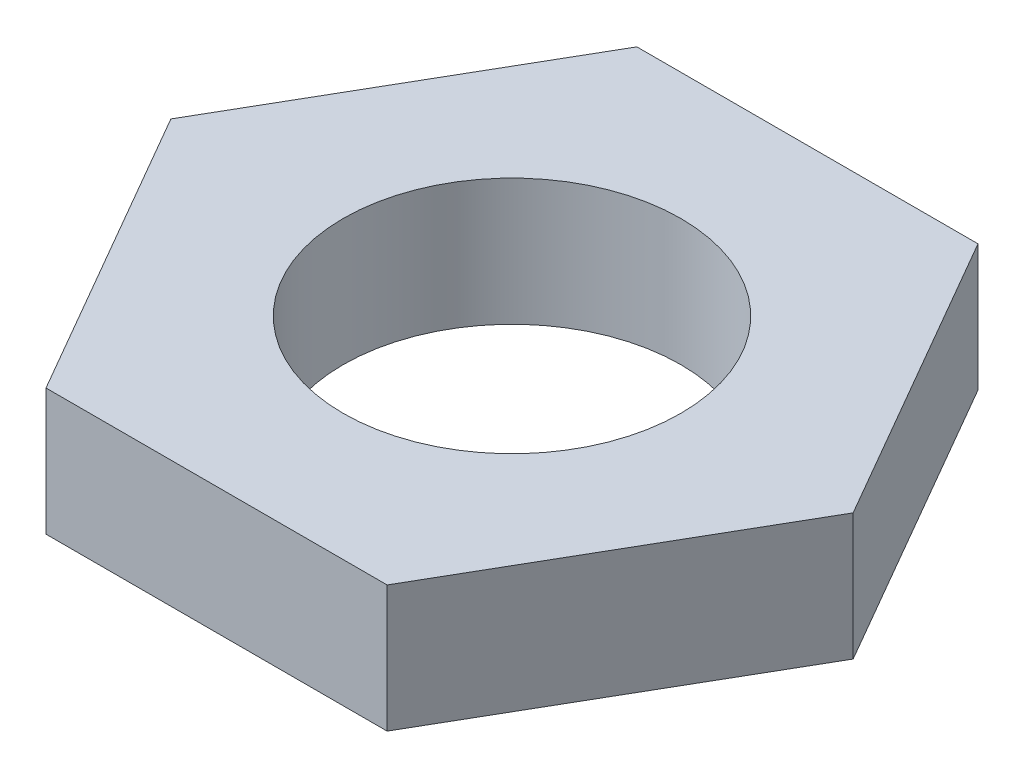
ISO-10303-21;
HEADER;
FILE_DESCRIPTION(('STEP AP214'),'2;1');
FILE_NAME('part.step','',(''),(''),'','','');
FILE_SCHEMA(('AUTOMOTIVE_DESIGN { 1 0 10303 214 1 1 1 1 }'));
ENDSEC;
DATA;
#1=APPLICATION_CONTEXT('core data for automotive mechanical design processes');
#2=APPLICATION_PROTOCOL_DEFINITION('international standard','automotive_design',2000,#1);
#3=PRODUCT_CONTEXT('',#1,'mechanical');
#4=PRODUCT('Part','Part','',(#3));
#5=PRODUCT_RELATED_PRODUCT_CATEGORY('part','',(#4));
#6=PRODUCT_DEFINITION_FORMATION('','',#4);
#7=PRODUCT_DEFINITION_CONTEXT('part definition',#1,'design');
#8=PRODUCT_DEFINITION('design','',#6,#7);
#9=PRODUCT_DEFINITION_SHAPE('','',#8);
#10=(LENGTH_UNIT() NAMED_UNIT(*) SI_UNIT(.MILLI.,.METRE.));
#11=(NAMED_UNIT(*) PLANE_ANGLE_UNIT() SI_UNIT($,.RADIAN.));
#12=(NAMED_UNIT(*) SI_UNIT($,.STERADIAN.) SOLID_ANGLE_UNIT());
#13=UNCERTAINTY_MEASURE_WITH_UNIT(LENGTH_MEASURE(1.E-05),#10,'distance_accuracy_value','');
#14=(GEOMETRIC_REPRESENTATION_CONTEXT(3) GLOBAL_UNCERTAINTY_ASSIGNED_CONTEXT((#13)) GLOBAL_UNIT_ASSIGNED_CONTEXT((#10,
#11,#12)) REPRESENTATION_CONTEXT('',''));
#15=CARTESIAN_POINT('',(0.,0.,0.));
#16=DIRECTION('',(0.,0.,1.));
#17=DIRECTION('',(1.,0.,0.));
#18=AXIS2_PLACEMENT_3D('',#15,#16,#17);
#19=CARTESIAN_POINT('',(0.,15.,0.));
#20=DIRECTION('',(0.,1.,0.));
#21=DIRECTION('',(0.,0.,1.));
#22=AXIS2_PLACEMENT_3D('',#19,#20,#21);
#23=PLANE('',#22);
#24=DIRECTION('',(-1.,0.,0.));
#25=VECTOR('',#24,1.);
#26=CARTESIAN_POINT('',(20.2072594216369,15.,-35.));
#27=LINE('',#26,#25);
#28=CARTESIAN_POINT('',(20.2072594216369,15.,-35.));
#29=VERTEX_POINT('',#28);
#30=CARTESIAN_POINT('',(-20.2072594216369,15.,-35.));
#31=VERTEX_POINT('',#30);
#32=EDGE_CURVE('E133',#29,#31,#27,.T.);
#33=ORIENTED_EDGE('',*,*,#32,.T.);
#34=DIRECTION('',(-0.5,0.,0.866025403784439));
#35=VECTOR('',#34,1.);
#36=CARTESIAN_POINT('',(-20.2072594216369,15.,-35.));
#37=LINE('',#36,#35);
#38=CARTESIAN_POINT('',(-40.4145188432738,15.,0.));
#39=VERTEX_POINT('',#38);
#40=EDGE_CURVE('E91',#31,#39,#37,.T.);
#41=ORIENTED_EDGE('',*,*,#40,.T.);
#42=DIRECTION('',(0.5,0.,0.866025403784438));
#43=VECTOR('',#42,1.);
#44=CARTESIAN_POINT('',(-40.4145188432738,15.,0.));
#45=LINE('',#44,#43);
#46=CARTESIAN_POINT('',(-20.2072594216369,15.,35.));
#47=VERTEX_POINT('',#46);
#48=EDGE_CURVE('E104',#39,#47,#45,.T.);
#49=ORIENTED_EDGE('',*,*,#48,.T.);
#50=DIRECTION('',(1.,0.,0.));
#51=VECTOR('',#50,1.);
#52=CARTESIAN_POINT('',(-20.2072594216369,15.,35.));
#53=LINE('',#52,#51);
#54=CARTESIAN_POINT('',(20.2072594216369,15.,35.));
#55=VERTEX_POINT('',#54);
#56=EDGE_CURVE('E98',#47,#55,#53,.T.);
#57=ORIENTED_EDGE('',*,*,#56,.T.);
#58=DIRECTION('',(0.5,0.,-0.866025403784439));
#59=VECTOR('',#58,1.);
#60=CARTESIAN_POINT('',(20.2072594216369,15.,35.));
#61=LINE('',#60,#59);
#62=CARTESIAN_POINT('',(40.4145188432738,15.,0.));
#63=VERTEX_POINT('',#62);
#64=EDGE_CURVE('E102',#55,#63,#61,.T.);
#65=ORIENTED_EDGE('',*,*,#64,.T.);
#66=DIRECTION('',(-0.5,0.,-0.866025403784438));
#67=VECTOR('',#66,1.);
#68=CARTESIAN_POINT('',(40.4145188432738,15.,0.));
#69=LINE('',#68,#67);
#70=EDGE_CURVE('E54',#63,#29,#69,.T.);
#71=ORIENTED_EDGE('',*,*,#70,.T.);
#72=EDGE_LOOP('',(#33,#41,#49,#57,#65,#71));
#73=FACE_BOUND('',#72,.T.);
#74=CARTESIAN_POINT('',(0.,15.,0.));
#75=DIRECTION('',(0.,1.,0.));
#76=DIRECTION('',(0.,0.,1.));
#77=AXIS2_PLACEMENT_3D('',#74,#75,#76);
#78=CIRCLE('',#77,20.);
#79=CARTESIAN_POINT('',(0.,15.,20.));
#80=VERTEX_POINT('',#79);
#81=EDGE_CURVE('E126',#80,#80,#78,.T.);
#82=ORIENTED_EDGE('',*,*,#81,.F.);
#83=EDGE_LOOP('',(#82));
#84=FACE_BOUND('',#83,.T.);
#85=ADVANCED_FACE('F37',(#73,#84),#23,.T.);
#86=CARTESIAN_POINT('',(0.,0.,0.));
#87=DIRECTION('',(0.,1.,0.));
#88=DIRECTION('',(0.,0.,1.));
#89=AXIS2_PLACEMENT_3D('',#86,#87,#88);
#90=PLANE('',#89);
#91=DIRECTION('',(-1.,0.,0.));
#92=VECTOR('',#91,1.);
#93=CARTESIAN_POINT('',(20.2072594216369,0.,-35.));
#94=LINE('',#93,#92);
#95=CARTESIAN_POINT('',(20.2072594216369,0.,-35.));
#96=VERTEX_POINT('',#95);
#97=CARTESIAN_POINT('',(-20.2072594216369,0.,-35.));
#98=VERTEX_POINT('',#97);
#99=EDGE_CURVE('E122',#96,#98,#94,.T.);
#100=ORIENTED_EDGE('',*,*,#99,.F.);
#101=DIRECTION('',(-0.5,0.,-0.866025403784438));
#102=VECTOR('',#101,1.);
#103=CARTESIAN_POINT('',(40.4145188432738,0.,0.));
#104=LINE('',#103,#102);
#105=CARTESIAN_POINT('',(40.4145188432738,0.,0.));
#106=VERTEX_POINT('',#105);
#107=EDGE_CURVE('E83',#106,#96,#104,.T.);
#108=ORIENTED_EDGE('',*,*,#107,.F.);
#109=DIRECTION('',(0.5,0.,-0.866025403784439));
#110=VECTOR('',#109,1.);
#111=CARTESIAN_POINT('',(20.2072594216369,0.,35.));
#112=LINE('',#111,#110);
#113=CARTESIAN_POINT('',(20.2072594216369,0.,35.));
#114=VERTEX_POINT('',#113);
#115=EDGE_CURVE('E77',#114,#106,#112,.T.);
#116=ORIENTED_EDGE('',*,*,#115,.F.);
#117=DIRECTION('',(1.,0.,0.));
#118=VECTOR('',#117,1.);
#119=CARTESIAN_POINT('',(-20.2072594216369,0.,35.));
#120=LINE('',#119,#118);
#121=CARTESIAN_POINT('',(-20.2072594216369,0.,35.));
#122=VERTEX_POINT('',#121);
#123=EDGE_CURVE('E112',#122,#114,#120,.T.);
#124=ORIENTED_EDGE('',*,*,#123,.F.);
#125=DIRECTION('',(0.5,0.,0.866025403784438));
#126=VECTOR('',#125,1.);
#127=CARTESIAN_POINT('',(-40.4145188432738,0.,0.));
#128=LINE('',#127,#126);
#129=CARTESIAN_POINT('',(-40.4145188432738,0.,0.));
#130=VERTEX_POINT('',#129);
#131=EDGE_CURVE('E128',#130,#122,#128,.T.);
#132=ORIENTED_EDGE('',*,*,#131,.F.);
#133=DIRECTION('',(-0.5,0.,0.866025403784439));
#134=VECTOR('',#133,1.);
#135=CARTESIAN_POINT('',(-20.2072594216369,0.,-35.));
#136=LINE('',#135,#134);
#137=EDGE_CURVE('E125',#98,#130,#136,.T.);
#138=ORIENTED_EDGE('',*,*,#137,.F.);
#139=EDGE_LOOP('',(#100,#108,#116,#124,#132,#138));
#140=FACE_BOUND('',#139,.T.);
#141=CARTESIAN_POINT('',(0.,0.,0.));
#142=DIRECTION('',(0.,1.,0.));
#143=DIRECTION('',(0.,0.,1.));
#144=AXIS2_PLACEMENT_3D('',#141,#142,#143);
#145=CIRCLE('',#144,20.);
#146=CARTESIAN_POINT('',(0.,0.,20.));
#147=VERTEX_POINT('',#146);
#148=EDGE_CURVE('E208',#147,#147,#145,.T.);
#149=ORIENTED_EDGE('',*,*,#148,.T.);
#150=EDGE_LOOP('',(#149));
#151=FACE_BOUND('',#150,.T.);
#152=ADVANCED_FACE('F142',(#140,#151),#90,.F.);
#153=CARTESIAN_POINT('',(20.2072594216369,15.,-35.));
#154=DIRECTION('',(0.,0.,1.));
#155=DIRECTION('',(1.,0.,0.));
#156=AXIS2_PLACEMENT_3D('',#153,#154,#155);
#157=PLANE('',#156);
#158=ORIENTED_EDGE('',*,*,#99,.T.);
#159=DIRECTION('',(0.,-1.,0.));
#160=VECTOR('',#159,1.);
#161=CARTESIAN_POINT('',(-20.2072594216369,15.,-35.));
#162=LINE('',#161,#160);
#163=EDGE_CURVE('E11',#31,#98,#162,.T.);
#164=ORIENTED_EDGE('',*,*,#163,.F.);
#165=ORIENTED_EDGE('',*,*,#32,.F.);
#166=DIRECTION('',(0.,-1.,0.));
#167=VECTOR('',#166,1.);
#168=CARTESIAN_POINT('',(20.2072594216369,15.,-35.));
#169=LINE('',#168,#167);
#170=EDGE_CURVE('E118',#29,#96,#169,.T.);
#171=ORIENTED_EDGE('',*,*,#170,.T.);
#172=EDGE_LOOP('',(#158,#164,#165,#171));
#173=FACE_BOUND('',#172,.T.);
#174=ADVANCED_FACE('F39',(#173),#157,.F.);
#175=CARTESIAN_POINT('',(-20.2072594216369,15.,-35.));
#176=DIRECTION('',(0.866025403784439,0.,0.5));
#177=DIRECTION('',(0.5,0.,-0.866025403784439));
#178=AXIS2_PLACEMENT_3D('',#175,#176,#177);
#179=PLANE('',#178);
#180=ORIENTED_EDGE('',*,*,#137,.T.);
#181=DIRECTION('',(0.,-1.,0.));
#182=VECTOR('',#181,1.);
#183=CARTESIAN_POINT('',(-40.4145188432738,15.,0.));
#184=LINE('',#183,#182);
#185=EDGE_CURVE('E46',#39,#130,#184,.T.);
#186=ORIENTED_EDGE('',*,*,#185,.F.);
#187=ORIENTED_EDGE('',*,*,#40,.F.);
#188=ORIENTED_EDGE('',*,*,#163,.T.);
#189=EDGE_LOOP('',(#180,#186,#187,#188));
#190=FACE_BOUND('',#189,.T.);
#191=ADVANCED_FACE('F167',(#190),#179,.F.);
#192=CARTESIAN_POINT('',(-40.4145188432738,15.,0.));
#193=DIRECTION('',(0.866025403784438,0.,-0.5));
#194=DIRECTION('',(-0.5,0.,-0.866025403784439));
#195=AXIS2_PLACEMENT_3D('',#192,#193,#194);
#196=PLANE('',#195);
#197=ORIENTED_EDGE('',*,*,#131,.T.);
#198=DIRECTION('',(0.,-1.,0.));
#199=VECTOR('',#198,1.);
#200=CARTESIAN_POINT('',(-20.2072594216369,15.,35.));
#201=LINE('',#200,#199);
#202=EDGE_CURVE('E113',#47,#122,#201,.T.);
#203=ORIENTED_EDGE('',*,*,#202,.F.);
#204=ORIENTED_EDGE('',*,*,#48,.F.);
#205=ORIENTED_EDGE('',*,*,#185,.T.);
#206=EDGE_LOOP('',(#197,#203,#204,#205));
#207=FACE_BOUND('',#206,.T.);
#208=ADVANCED_FACE('F139',(#207),#196,.F.);
#209=CARTESIAN_POINT('',(-20.2072594216369,15.,35.));
#210=DIRECTION('',(0.,0.,-1.));
#211=DIRECTION('',(-1.,0.,0.));
#212=AXIS2_PLACEMENT_3D('',#209,#210,#211);
#213=PLANE('',#212);
#214=ORIENTED_EDGE('',*,*,#123,.T.);
#215=DIRECTION('',(0.,-1.,0.));
#216=VECTOR('',#215,1.);
#217=CARTESIAN_POINT('',(20.2072594216369,15.,35.));
#218=LINE('',#217,#216);
#219=EDGE_CURVE('E109',#55,#114,#218,.T.);
#220=ORIENTED_EDGE('',*,*,#219,.F.);
#221=ORIENTED_EDGE('',*,*,#56,.F.);
#222=ORIENTED_EDGE('',*,*,#202,.T.);
#223=EDGE_LOOP('',(#214,#220,#221,#222));
#224=FACE_BOUND('',#223,.T.);
#225=ADVANCED_FACE('F110',(#224),#213,.F.);
#226=CARTESIAN_POINT('',(20.2072594216369,15.,35.));
#227=DIRECTION('',(-0.866025403784439,0.,-0.5));
#228=DIRECTION('',(-0.5,0.,0.866025403784439));
#229=AXIS2_PLACEMENT_3D('',#226,#227,#228);
#230=PLANE('',#229);
#231=ORIENTED_EDGE('',*,*,#115,.T.);
#232=DIRECTION('',(0.,-1.,0.));
#233=VECTOR('',#232,1.);
#234=CARTESIAN_POINT('',(40.4145188432738,15.,0.));
#235=LINE('',#234,#233);
#236=EDGE_CURVE('E114',#63,#106,#235,.T.);
#237=ORIENTED_EDGE('',*,*,#236,.F.);
#238=ORIENTED_EDGE('',*,*,#64,.F.);
#239=ORIENTED_EDGE('',*,*,#219,.T.);
#240=EDGE_LOOP('',(#231,#237,#238,#239));
#241=FACE_BOUND('',#240,.T.);
#242=ADVANCED_FACE('F116',(#241),#230,.F.);
#243=CARTESIAN_POINT('',(40.4145188432738,15.,0.));
#244=DIRECTION('',(-0.866025403784439,0.,0.5));
#245=DIRECTION('',(0.5,0.,0.866025403784439));
#246=AXIS2_PLACEMENT_3D('',#243,#244,#245);
#247=PLANE('',#246);
#248=ORIENTED_EDGE('',*,*,#107,.T.);
#249=ORIENTED_EDGE('',*,*,#170,.F.);
#250=ORIENTED_EDGE('',*,*,#70,.F.);
#251=ORIENTED_EDGE('',*,*,#236,.T.);
#252=EDGE_LOOP('',(#248,#249,#250,#251));
#253=FACE_BOUND('',#252,.T.);
#254=ADVANCED_FACE('F147',(#253),#247,.F.);
#255=CARTESIAN_POINT('',(0.,15.,0.));
#256=DIRECTION('',(0.,-1.,0.));
#257=DIRECTION('',(0.,0.,-1.));
#258=AXIS2_PLACEMENT_3D('',#255,#256,#257);
#259=CYLINDRICAL_SURFACE('',#258,20.);
#260=ORIENTED_EDGE('',*,*,#81,.T.);
#261=EDGE_LOOP('',(#260));
#262=FACE_BOUND('',#261,.T.);
#263=ORIENTED_EDGE('',*,*,#148,.F.);
#264=EDGE_LOOP('',(#263));
#265=FACE_BOUND('',#264,.T.);
#266=ADVANCED_FACE('F149',(#262,#265),#259,.F.);
#267=CLOSED_SHELL('',(#85,#152,#174,#191,#208,#225,#242,#254,#266));
#268=MANIFOLD_SOLID_BREP('B2',#267);
#269=ADVANCED_BREP_SHAPE_REPRESENTATION('',(#18,#268),#14);
#270=SHAPE_DEFINITION_REPRESENTATION(#9,#269);
ENDSEC;
END-ISO-10303-21;
